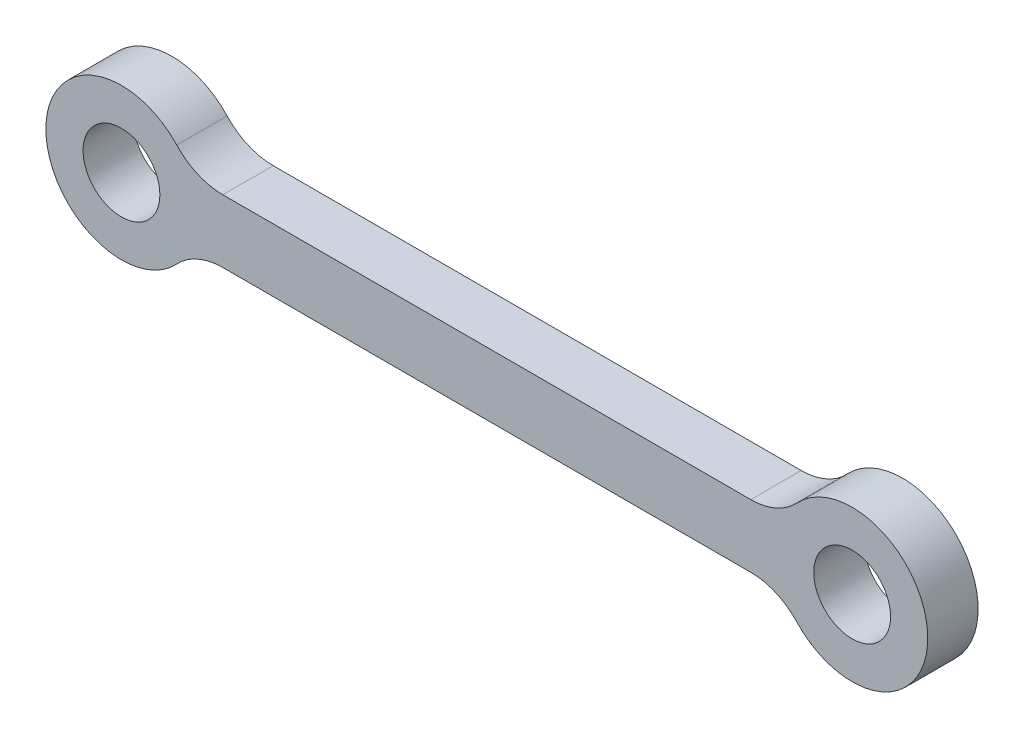
ISO-10303-21;
HEADER;
FILE_DESCRIPTION(('STEP AP214'),'2;1');
FILE_NAME('part.step','',(''),(''),'','','');
FILE_SCHEMA(('AUTOMOTIVE_DESIGN { 1 0 10303 214 1 1 1 1 }'));
ENDSEC;
DATA;
#1=APPLICATION_CONTEXT('core data for automotive mechanical design processes');
#2=APPLICATION_PROTOCOL_DEFINITION('international standard','automotive_design',2000,#1);
#3=PRODUCT_CONTEXT('',#1,'mechanical');
#4=PRODUCT('Part','Part','',(#3));
#5=PRODUCT_RELATED_PRODUCT_CATEGORY('part','',(#4));
#6=PRODUCT_DEFINITION_FORMATION('','',#4);
#7=PRODUCT_DEFINITION_CONTEXT('part definition',#1,'design');
#8=PRODUCT_DEFINITION('design','',#6,#7);
#9=PRODUCT_DEFINITION_SHAPE('','',#8);
#10=(LENGTH_UNIT() NAMED_UNIT(*) SI_UNIT(.MILLI.,.METRE.));
#11=(NAMED_UNIT(*) PLANE_ANGLE_UNIT() SI_UNIT($,.RADIAN.));
#12=(NAMED_UNIT(*) SI_UNIT($,.STERADIAN.) SOLID_ANGLE_UNIT());
#13=UNCERTAINTY_MEASURE_WITH_UNIT(LENGTH_MEASURE(1.E-05),#10,'distance_accuracy_value','');
#14=(GEOMETRIC_REPRESENTATION_CONTEXT(3) GLOBAL_UNCERTAINTY_ASSIGNED_CONTEXT((#13)) GLOBAL_UNIT_ASSIGNED_CONTEXT((#10,
#11,#12)) REPRESENTATION_CONTEXT('',''));
#15=CARTESIAN_POINT('',(0.,0.,0.));
#16=DIRECTION('',(0.,0.,1.));
#17=DIRECTION('',(1.,0.,0.));
#18=AXIS2_PLACEMENT_3D('',#15,#16,#17);
#19=CARTESIAN_POINT('',(-29.,0.,2.));
#20=DIRECTION('',(0.,0.,-1.));
#21=DIRECTION('',(-1.,0.,0.));
#22=AXIS2_PLACEMENT_3D('',#19,#20,#21);
#23=PLANE('',#22);
#24=CARTESIAN_POINT('',(-29.,0.,2.));
#25=DIRECTION('',(0.,0.,1.));
#26=DIRECTION('',(1.,0.,0.));
#27=AXIS2_PLACEMENT_3D('',#24,#25,#26);
#28=CIRCLE('',#27,3.05);
#29=CARTESIAN_POINT('',(-25.95,0.,2.));
#30=VERTEX_POINT('',#29);
#31=EDGE_CURVE('E120',#30,#30,#28,.T.);
#32=ORIENTED_EDGE('',*,*,#31,.F.);
#33=EDGE_LOOP('',(#32));
#34=FACE_BOUND('',#33,.T.);
#35=CARTESIAN_POINT('',(29.,0.,2.));
#36=DIRECTION('',(0.,0.,1.));
#37=DIRECTION('',(1.,0.,0.));
#38=AXIS2_PLACEMENT_3D('',#35,#36,#37);
#39=CIRCLE('',#38,3.05);
#40=CARTESIAN_POINT('',(32.05,0.,2.));
#41=VERTEX_POINT('',#40);
#42=EDGE_CURVE('E149',#41,#41,#39,.T.);
#43=ORIENTED_EDGE('',*,*,#42,.F.);
#44=EDGE_LOOP('',(#43));
#45=FACE_BOUND('',#44,.T.);
#46=DIRECTION('',(1.,0.,0.));
#47=VECTOR('',#46,1.);
#48=CARTESIAN_POINT('',(0.,2.5,2.));
#49=LINE('',#48,#47);
#50=CARTESIAN_POINT('',(-20.9532615302845,2.5,2.));
#51=VERTEX_POINT('',#50);
#52=CARTESIAN_POINT('',(20.9532615302845,2.5,2.));
#53=VERTEX_POINT('',#52);
#54=EDGE_CURVE('E141',#51,#53,#49,.T.);
#55=ORIENTED_EDGE('',*,*,#54,.F.);
#56=CARTESIAN_POINT('',(-20.9532615302845,7.5,2.));
#57=DIRECTION('',(0.,0.,-1.));
#58=DIRECTION('',(-1.,0.,0.));
#59=AXIS2_PLACEMENT_3D('',#56,#57,#58);
#60=CIRCLE('',#59,5.);
#61=CARTESIAN_POINT('',(-24.6108699256097,4.09090909090909,2.));
#62=VERTEX_POINT('',#61);
#63=EDGE_CURVE('E42',#51,#62,#60,.T.);
#64=ORIENTED_EDGE('',*,*,#63,.T.);
#65=CARTESIAN_POINT('',(-29.,0.,2.));
#66=DIRECTION('',(0.,0.,1.));
#67=DIRECTION('',(-1.,0.,0.));
#68=AXIS2_PLACEMENT_3D('',#65,#66,#67);
#69=CIRCLE('',#68,6.);
#70=CARTESIAN_POINT('',(-24.6108699256097,-4.09090909090909,2.));
#71=VERTEX_POINT('',#70);
#72=EDGE_CURVE('E106',#62,#71,#69,.T.);
#73=ORIENTED_EDGE('',*,*,#72,.T.);
#74=CARTESIAN_POINT('',(-20.9532615302845,-7.5,2.));
#75=DIRECTION('',(0.,0.,-1.));
#76=DIRECTION('',(-1.,0.,0.));
#77=AXIS2_PLACEMENT_3D('',#74,#75,#76);
#78=CIRCLE('',#77,5.);
#79=CARTESIAN_POINT('',(-20.9532615302845,-2.5,2.));
#80=VERTEX_POINT('',#79);
#81=EDGE_CURVE('E127',#71,#80,#78,.T.);
#82=ORIENTED_EDGE('',*,*,#81,.T.);
#83=DIRECTION('',(1.,0.,0.));
#84=VECTOR('',#83,1.);
#85=CARTESIAN_POINT('',(0.,-2.5,2.));
#86=LINE('',#85,#84);
#87=CARTESIAN_POINT('',(20.9532615302845,-2.5,2.));
#88=VERTEX_POINT('',#87);
#89=EDGE_CURVE('E143',#80,#88,#86,.T.);
#90=ORIENTED_EDGE('',*,*,#89,.T.);
#91=CARTESIAN_POINT('',(20.9532615302845,-7.5,2.));
#92=DIRECTION('',(0.,0.,-1.));
#93=DIRECTION('',(-1.,0.,0.));
#94=AXIS2_PLACEMENT_3D('',#91,#92,#93);
#95=CIRCLE('',#94,5.);
#96=CARTESIAN_POINT('',(24.6108699256097,-4.09090909090909,2.));
#97=VERTEX_POINT('',#96);
#98=EDGE_CURVE('E135',#88,#97,#95,.T.);
#99=ORIENTED_EDGE('',*,*,#98,.T.);
#100=CARTESIAN_POINT('',(29.,0.,2.));
#101=DIRECTION('',(0.,0.,1.));
#102=DIRECTION('',(1.,0.,0.));
#103=AXIS2_PLACEMENT_3D('',#100,#101,#102);
#104=CIRCLE('',#103,6.);
#105=CARTESIAN_POINT('',(24.6108699256097,4.0909090909091,2.));
#106=VERTEX_POINT('',#105);
#107=EDGE_CURVE('E160',#97,#106,#104,.T.);
#108=ORIENTED_EDGE('',*,*,#107,.T.);
#109=CARTESIAN_POINT('',(20.9532615302845,7.5,2.));
#110=DIRECTION('',(0.,0.,-1.));
#111=DIRECTION('',(-1.,0.,0.));
#112=AXIS2_PLACEMENT_3D('',#109,#110,#111);
#113=CIRCLE('',#112,5.);
#114=EDGE_CURVE('E49',#106,#53,#113,.T.);
#115=ORIENTED_EDGE('',*,*,#114,.T.);
#116=EDGE_LOOP('',(#55,#64,#73,#82,#90,#99,#108,#115));
#117=FACE_BOUND('',#116,.T.);
#118=ADVANCED_FACE('F34',(#34,#45,#117),#23,.F.);
#119=CARTESIAN_POINT('',(-29.,0.,-2.));
#120=DIRECTION('',(0.,0.,-1.));
#121=DIRECTION('',(-1.,0.,0.));
#122=AXIS2_PLACEMENT_3D('',#119,#120,#121);
#123=PLANE('',#122);
#124=CARTESIAN_POINT('',(-29.,0.,-2.));
#125=DIRECTION('',(0.,0.,1.));
#126=DIRECTION('',(1.,0.,0.));
#127=AXIS2_PLACEMENT_3D('',#124,#125,#126);
#128=CIRCLE('',#127,3.05);
#129=CARTESIAN_POINT('',(-25.95,0.,-2.));
#130=VERTEX_POINT('',#129);
#131=EDGE_CURVE('E152',#130,#130,#128,.T.);
#132=ORIENTED_EDGE('',*,*,#131,.T.);
#133=EDGE_LOOP('',(#132));
#134=FACE_BOUND('',#133,.T.);
#135=CARTESIAN_POINT('',(29.,0.,-2.));
#136=DIRECTION('',(0.,0.,1.));
#137=DIRECTION('',(1.,0.,0.));
#138=AXIS2_PLACEMENT_3D('',#135,#136,#137);
#139=CIRCLE('',#138,3.05);
#140=CARTESIAN_POINT('',(32.05,0.,-2.));
#141=VERTEX_POINT('',#140);
#142=EDGE_CURVE('E146',#141,#141,#139,.T.);
#143=ORIENTED_EDGE('',*,*,#142,.T.);
#144=EDGE_LOOP('',(#143));
#145=FACE_BOUND('',#144,.T.);
#146=CARTESIAN_POINT('',(29.,0.,-2.));
#147=DIRECTION('',(0.,0.,1.));
#148=DIRECTION('',(1.,0.,0.));
#149=AXIS2_PLACEMENT_3D('',#146,#147,#148);
#150=CIRCLE('',#149,6.);
#151=CARTESIAN_POINT('',(24.6108699256097,-4.09090909090909,-2.));
#152=VERTEX_POINT('',#151);
#153=CARTESIAN_POINT('',(24.6108699256097,4.0909090909091,-2.));
#154=VERTEX_POINT('',#153);
#155=EDGE_CURVE('E119',#152,#154,#150,.T.);
#156=ORIENTED_EDGE('',*,*,#155,.F.);
#157=CARTESIAN_POINT('',(20.9532615302845,-7.5,-2.));
#158=DIRECTION('',(0.,0.,-1.));
#159=DIRECTION('',(-1.,0.,0.));
#160=AXIS2_PLACEMENT_3D('',#157,#158,#159);
#161=CIRCLE('',#160,5.);
#162=CARTESIAN_POINT('',(20.9532615302845,-2.5,-2.));
#163=VERTEX_POINT('',#162);
#164=EDGE_CURVE('E137',#152,#163,#161,.F.);
#165=ORIENTED_EDGE('',*,*,#164,.T.);
#166=DIRECTION('',(-1.,0.,0.));
#167=VECTOR('',#166,1.);
#168=CARTESIAN_POINT('',(-29.,-2.5,-2.));
#169=LINE('',#168,#167);
#170=CARTESIAN_POINT('',(-20.9532615302845,-2.5,-2.));
#171=VERTEX_POINT('',#170);
#172=EDGE_CURVE('E109',#163,#171,#169,.T.);
#173=ORIENTED_EDGE('',*,*,#172,.T.);
#174=CARTESIAN_POINT('',(-20.9532615302845,-7.5,-2.));
#175=DIRECTION('',(0.,0.,-1.));
#176=DIRECTION('',(-1.,0.,0.));
#177=AXIS2_PLACEMENT_3D('',#174,#175,#176);
#178=CIRCLE('',#177,5.);
#179=CARTESIAN_POINT('',(-24.6108699256097,-4.09090909090909,-2.));
#180=VERTEX_POINT('',#179);
#181=EDGE_CURVE('E118',#171,#180,#178,.F.);
#182=ORIENTED_EDGE('',*,*,#181,.T.);
#183=CARTESIAN_POINT('',(-29.,0.,-2.));
#184=DIRECTION('',(0.,0.,1.));
#185=DIRECTION('',(-1.,0.,0.));
#186=AXIS2_PLACEMENT_3D('',#183,#184,#185);
#187=CIRCLE('',#186,6.);
#188=CARTESIAN_POINT('',(-24.6108699256097,4.09090909090909,-2.));
#189=VERTEX_POINT('',#188);
#190=EDGE_CURVE('E103',#189,#180,#187,.T.);
#191=ORIENTED_EDGE('',*,*,#190,.F.);
#192=CARTESIAN_POINT('',(-20.9532615302845,7.5,-2.));
#193=DIRECTION('',(0.,0.,-1.));
#194=DIRECTION('',(-1.,0.,0.));
#195=AXIS2_PLACEMENT_3D('',#192,#193,#194);
#196=CIRCLE('',#195,5.);
#197=CARTESIAN_POINT('',(-20.9532615302845,2.5,-2.));
#198=VERTEX_POINT('',#197);
#199=EDGE_CURVE('E11',#189,#198,#196,.F.);
#200=ORIENTED_EDGE('',*,*,#199,.T.);
#201=DIRECTION('',(-1.,0.,0.));
#202=VECTOR('',#201,1.);
#203=CARTESIAN_POINT('',(-29.,2.5,-2.));
#204=LINE('',#203,#202);
#205=CARTESIAN_POINT('',(20.9532615302845,2.5,-2.));
#206=VERTEX_POINT('',#205);
#207=EDGE_CURVE('E161',#206,#198,#204,.T.);
#208=ORIENTED_EDGE('',*,*,#207,.F.);
#209=CARTESIAN_POINT('',(20.9532615302845,7.5,-2.));
#210=DIRECTION('',(0.,0.,-1.));
#211=DIRECTION('',(-1.,0.,0.));
#212=AXIS2_PLACEMENT_3D('',#209,#210,#211);
#213=CIRCLE('',#212,5.);
#214=EDGE_CURVE('E140',#206,#154,#213,.F.);
#215=ORIENTED_EDGE('',*,*,#214,.T.);
#216=EDGE_LOOP('',(#156,#165,#173,#182,#191,#200,#208,#215));
#217=FACE_BOUND('',#216,.T.);
#218=ADVANCED_FACE('F113',(#134,#145,#217),#123,.T.);
#219=CARTESIAN_POINT('',(-29.,0.,2.));
#220=DIRECTION('',(0.,0.,-1.));
#221=DIRECTION('',(-1.,0.,0.));
#222=AXIS2_PLACEMENT_3D('',#219,#220,#221);
#223=CYLINDRICAL_SURFACE('',#222,6.);
#224=ORIENTED_EDGE('',*,*,#190,.T.);
#225=DIRECTION('',(0.,0.,-1.));
#226=VECTOR('',#225,1.);
#227=CARTESIAN_POINT('',(-24.6108699256097,-4.09090909090909,2.));
#228=LINE('',#227,#226);
#229=EDGE_CURVE('E108',#180,#71,#228,.F.);
#230=ORIENTED_EDGE('',*,*,#229,.T.);
#231=ORIENTED_EDGE('',*,*,#72,.F.);
#232=DIRECTION('',(0.,0.,-1.));
#233=VECTOR('',#232,1.);
#234=CARTESIAN_POINT('',(-24.6108699256097,4.09090909090909,2.));
#235=LINE('',#234,#233);
#236=EDGE_CURVE('E99',#62,#189,#235,.T.);
#237=ORIENTED_EDGE('',*,*,#236,.T.);
#238=EDGE_LOOP('',(#224,#230,#231,#237));
#239=FACE_BOUND('',#238,.T.);
#240=ADVANCED_FACE('F101',(#239),#223,.T.);
#241=CARTESIAN_POINT('',(29.,0.,2.));
#242=DIRECTION('',(0.,0.,-1.));
#243=DIRECTION('',(-1.,0.,0.));
#244=AXIS2_PLACEMENT_3D('',#241,#242,#243);
#245=CYLINDRICAL_SURFACE('',#244,6.);
#246=ORIENTED_EDGE('',*,*,#107,.F.);
#247=DIRECTION('',(0.,0.,-1.));
#248=VECTOR('',#247,1.);
#249=CARTESIAN_POINT('',(24.6108699256097,-4.09090909090909,2.));
#250=LINE('',#249,#248);
#251=EDGE_CURVE('E125',#97,#152,#250,.T.);
#252=ORIENTED_EDGE('',*,*,#251,.T.);
#253=ORIENTED_EDGE('',*,*,#155,.T.);
#254=DIRECTION('',(0.,0.,-1.));
#255=VECTOR('',#254,1.);
#256=CARTESIAN_POINT('',(24.6108699256097,4.0909090909091,2.));
#257=LINE('',#256,#255);
#258=EDGE_CURVE('E129',#154,#106,#257,.F.);
#259=ORIENTED_EDGE('',*,*,#258,.T.);
#260=EDGE_LOOP('',(#246,#252,#253,#259));
#261=FACE_BOUND('',#260,.T.);
#262=ADVANCED_FACE('F176',(#261),#245,.T.);
#263=CARTESIAN_POINT('',(-29.,0.,2.));
#264=DIRECTION('',(0.,0.,-1.));
#265=DIRECTION('',(-1.,0.,0.));
#266=AXIS2_PLACEMENT_3D('',#263,#264,#265);
#267=CYLINDRICAL_SURFACE('',#266,3.05);
#268=ORIENTED_EDGE('',*,*,#31,.T.);
#269=EDGE_LOOP('',(#268));
#270=FACE_BOUND('',#269,.T.);
#271=ORIENTED_EDGE('',*,*,#131,.F.);
#272=EDGE_LOOP('',(#271));
#273=FACE_BOUND('',#272,.T.);
#274=ADVANCED_FACE('F213',(#270,#273),#267,.F.);
#275=CARTESIAN_POINT('',(29.,0.,2.));
#276=DIRECTION('',(0.,0.,-1.));
#277=DIRECTION('',(-1.,0.,0.));
#278=AXIS2_PLACEMENT_3D('',#275,#276,#277);
#279=CYLINDRICAL_SURFACE('',#278,3.05);
#280=ORIENTED_EDGE('',*,*,#42,.T.);
#281=EDGE_LOOP('',(#280));
#282=FACE_BOUND('',#281,.T.);
#283=ORIENTED_EDGE('',*,*,#142,.F.);
#284=EDGE_LOOP('',(#283));
#285=FACE_BOUND('',#284,.T.);
#286=ADVANCED_FACE('F233',(#282,#285),#279,.F.);
#287=CARTESIAN_POINT('',(0.,2.5,-2.2));
#288=DIRECTION('',(0.,-1.,0.));
#289=DIRECTION('',(0.,0.,-1.));
#290=AXIS2_PLACEMENT_3D('',#287,#288,#289);
#291=PLANE('',#290);
#292=ORIENTED_EDGE('',*,*,#54,.T.);
#293=DIRECTION('',(0.,0.,1.));
#294=VECTOR('',#293,1.);
#295=CARTESIAN_POINT('',(20.9532615302845,2.5,-2.));
#296=LINE('',#295,#294);
#297=EDGE_CURVE('E124',#53,#206,#296,.F.);
#298=ORIENTED_EDGE('',*,*,#297,.T.);
#299=ORIENTED_EDGE('',*,*,#207,.T.);
#300=DIRECTION('',(0.,0.,1.));
#301=VECTOR('',#300,1.);
#302=CARTESIAN_POINT('',(-20.9532615302845,2.5,2.));
#303=LINE('',#302,#301);
#304=EDGE_CURVE('E122',#198,#51,#303,.T.);
#305=ORIENTED_EDGE('',*,*,#304,.T.);
#306=EDGE_LOOP('',(#292,#298,#299,#305));
#307=FACE_BOUND('',#306,.T.);
#308=ADVANCED_FACE('F199',(#307),#291,.F.);
#309=CARTESIAN_POINT('',(0.,-2.5,-2.2));
#310=DIRECTION('',(0.,-1.,0.));
#311=DIRECTION('',(0.,0.,-1.));
#312=AXIS2_PLACEMENT_3D('',#309,#310,#311);
#313=PLANE('',#312);
#314=ORIENTED_EDGE('',*,*,#89,.F.);
#315=DIRECTION('',(0.,0.,-1.));
#316=VECTOR('',#315,1.);
#317=CARTESIAN_POINT('',(-20.9532615302845,-2.5,-2.2));
#318=LINE('',#317,#316);
#319=EDGE_CURVE('E171',#80,#171,#318,.T.);
#320=ORIENTED_EDGE('',*,*,#319,.T.);
#321=ORIENTED_EDGE('',*,*,#172,.F.);
#322=DIRECTION('',(0.,0.,-1.));
#323=VECTOR('',#322,1.);
#324=CARTESIAN_POINT('',(20.9532615302845,-2.5,-2.2));
#325=LINE('',#324,#323);
#326=EDGE_CURVE('E168',#163,#88,#325,.F.);
#327=ORIENTED_EDGE('',*,*,#326,.T.);
#328=EDGE_LOOP('',(#314,#320,#321,#327));
#329=FACE_BOUND('',#328,.T.);
#330=ADVANCED_FACE('F187',(#329),#313,.T.);
#331=CARTESIAN_POINT('',(-20.9532615302845,-7.5,2.));
#332=DIRECTION('',(0.,0.,-1.));
#333=DIRECTION('',(-1.,0.,0.));
#334=AXIS2_PLACEMENT_3D('',#331,#332,#333);
#335=CYLINDRICAL_SURFACE('',#334,5.);
#336=ORIENTED_EDGE('',*,*,#181,.F.);
#337=ORIENTED_EDGE('',*,*,#319,.F.);
#338=ORIENTED_EDGE('',*,*,#81,.F.);
#339=ORIENTED_EDGE('',*,*,#229,.F.);
#340=EDGE_LOOP('',(#336,#337,#338,#339));
#341=FACE_BOUND('',#340,.T.);
#342=ADVANCED_FACE('F190',(#341),#335,.F.);
#343=CARTESIAN_POINT('',(20.9532615302845,-7.5,2.));
#344=DIRECTION('',(0.,0.,-1.));
#345=DIRECTION('',(-1.,0.,0.));
#346=AXIS2_PLACEMENT_3D('',#343,#344,#345);
#347=CYLINDRICAL_SURFACE('',#346,5.);
#348=ORIENTED_EDGE('',*,*,#164,.F.);
#349=ORIENTED_EDGE('',*,*,#251,.F.);
#350=ORIENTED_EDGE('',*,*,#98,.F.);
#351=ORIENTED_EDGE('',*,*,#326,.F.);
#352=EDGE_LOOP('',(#348,#349,#350,#351));
#353=FACE_BOUND('',#352,.T.);
#354=ADVANCED_FACE('F184',(#353),#347,.F.);
#355=CARTESIAN_POINT('',(20.9532615302845,7.5,2.));
#356=DIRECTION('',(0.,0.,-1.));
#357=DIRECTION('',(-1.,0.,0.));
#358=AXIS2_PLACEMENT_3D('',#355,#356,#357);
#359=CYLINDRICAL_SURFACE('',#358,5.);
#360=ORIENTED_EDGE('',*,*,#214,.F.);
#361=ORIENTED_EDGE('',*,*,#297,.F.);
#362=ORIENTED_EDGE('',*,*,#114,.F.);
#363=ORIENTED_EDGE('',*,*,#258,.F.);
#364=EDGE_LOOP('',(#360,#361,#362,#363));
#365=FACE_BOUND('',#364,.T.);
#366=ADVANCED_FACE('F197',(#365),#359,.F.);
#367=CARTESIAN_POINT('',(-20.9532615302845,7.5,2.));
#368=DIRECTION('',(0.,0.,-1.));
#369=DIRECTION('',(-1.,0.,0.));
#370=AXIS2_PLACEMENT_3D('',#367,#368,#369);
#371=CYLINDRICAL_SURFACE('',#370,5.);
#372=ORIENTED_EDGE('',*,*,#199,.F.);
#373=ORIENTED_EDGE('',*,*,#236,.F.);
#374=ORIENTED_EDGE('',*,*,#63,.F.);
#375=ORIENTED_EDGE('',*,*,#304,.F.);
#376=EDGE_LOOP('',(#372,#373,#374,#375));
#377=FACE_BOUND('',#376,.T.);
#378=ADVANCED_FACE('F36',(#377),#371,.F.);
#379=CLOSED_SHELL('',(#118,#218,#240,#262,#274,#286,#308,#330,#342,#354,#366,#378));
#380=MANIFOLD_SOLID_BREP('B2',#379);
#381=ADVANCED_BREP_SHAPE_REPRESENTATION('',(#18,#380),#14);
#382=SHAPE_DEFINITION_REPRESENTATION(#9,#381);
ENDSEC;
END-ISO-10303-21;
